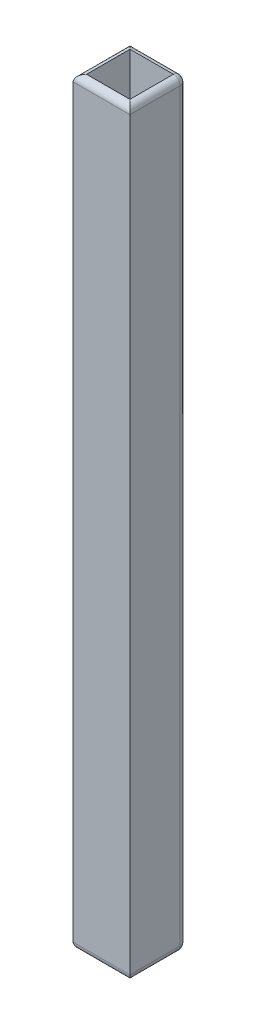
ISO-10303-21;
HEADER;
FILE_DESCRIPTION(('STEP AP214'),'2;1');
FILE_NAME('part.step','',(''),(''),'','','');
FILE_SCHEMA(('AUTOMOTIVE_DESIGN { 1 0 10303 214 1 1 1 1 }'));
ENDSEC;
DATA;
#1=APPLICATION_CONTEXT('core data for automotive mechanical design processes');
#2=APPLICATION_PROTOCOL_DEFINITION('international standard','automotive_design',2000,#1);
#3=PRODUCT_CONTEXT('',#1,'mechanical');
#4=PRODUCT('Part','Part','',(#3));
#5=PRODUCT_RELATED_PRODUCT_CATEGORY('part','',(#4));
#6=PRODUCT_DEFINITION_FORMATION('','',#4);
#7=PRODUCT_DEFINITION_CONTEXT('part definition',#1,'design');
#8=PRODUCT_DEFINITION('design','',#6,#7);
#9=PRODUCT_DEFINITION_SHAPE('','',#8);
#10=(LENGTH_UNIT() NAMED_UNIT(*) SI_UNIT(.MILLI.,.METRE.));
#11=(NAMED_UNIT(*) PLANE_ANGLE_UNIT() SI_UNIT($,.RADIAN.));
#12=(NAMED_UNIT(*) SI_UNIT($,.STERADIAN.) SOLID_ANGLE_UNIT());
#13=UNCERTAINTY_MEASURE_WITH_UNIT(LENGTH_MEASURE(1.E-05),#10,'distance_accuracy_value','');
#14=(GEOMETRIC_REPRESENTATION_CONTEXT(3) GLOBAL_UNCERTAINTY_ASSIGNED_CONTEXT((#13)) GLOBAL_UNIT_ASSIGNED_CONTEXT((#10,
#11,#12)) REPRESENTATION_CONTEXT('',''));
#15=CARTESIAN_POINT('',(0.,0.,0.));
#16=DIRECTION('',(0.,0.,1.));
#17=DIRECTION('',(1.,0.,0.));
#18=AXIS2_PLACEMENT_3D('',#15,#16,#17);
#19=CARTESIAN_POINT('',(-4.25,56.75,4.25));
#20=DIRECTION('',(1.,0.,0.));
#21=DIRECTION('',(0.,0.,-1.));
#22=AXIS2_PLACEMENT_3D('',#19,#20,#21);
#23=PLANE('',#22);
#24=DIRECTION('',(0.,-1.,0.));
#25=VECTOR('',#24,1.);
#26=CARTESIAN_POINT('',(-4.25,56.75,-4.25));
#27=LINE('',#26,#25);
#28=CARTESIAN_POINT('',(-4.25,55.75,-4.25));
#29=VERTEX_POINT('',#28);
#30=CARTESIAN_POINT('',(-4.25,-55.75,-4.25));
#31=VERTEX_POINT('',#30);
#32=EDGE_CURVE('E129',#29,#31,#27,.T.);
#33=ORIENTED_EDGE('',*,*,#32,.T.);
#34=DIRECTION('',(0.,0.,1.));
#35=VECTOR('',#34,1.);
#36=CARTESIAN_POINT('',(-4.25,-55.75,4.25));
#37=LINE('',#36,#35);
#38=CARTESIAN_POINT('',(-4.25,-55.75,4.25));
#39=VERTEX_POINT('',#38);
#40=EDGE_CURVE('E56',#31,#39,#37,.T.);
#41=ORIENTED_EDGE('',*,*,#40,.T.);
#42=DIRECTION('',(0.,-1.,0.));
#43=VECTOR('',#42,1.);
#44=CARTESIAN_POINT('',(-4.25,56.75,4.25));
#45=LINE('',#44,#43);
#46=CARTESIAN_POINT('',(-4.25,55.75,4.25));
#47=VERTEX_POINT('',#46);
#48=EDGE_CURVE('E213',#47,#39,#45,.T.);
#49=ORIENTED_EDGE('',*,*,#48,.F.);
#50=DIRECTION('',(0.,0.,1.));
#51=VECTOR('',#50,1.);
#52=CARTESIAN_POINT('',(-4.25,55.75,4.25));
#53=LINE('',#52,#51);
#54=EDGE_CURVE('E218',#47,#29,#53,.F.);
#55=ORIENTED_EDGE('',*,*,#54,.T.);
#56=EDGE_LOOP('',(#33,#41,#49,#55));
#57=FACE_BOUND('',#56,.T.);
#58=ADVANCED_FACE('F33',(#57),#23,.F.);
#59=CARTESIAN_POINT('',(-4.25,56.75,4.25));
#60=DIRECTION('',(0.,0.,-1.));
#61=DIRECTION('',(-1.,0.,0.));
#62=AXIS2_PLACEMENT_3D('',#59,#60,#61);
#63=PLANE('',#62);
#64=ORIENTED_EDGE('',*,*,#48,.T.);
#65=DIRECTION('',(1.,0.,0.));
#66=VECTOR('',#65,1.);
#67=CARTESIAN_POINT('',(4.25,-55.75,4.25));
#68=LINE('',#67,#66);
#69=CARTESIAN_POINT('',(4.25,-55.75,4.25));
#70=VERTEX_POINT('',#69);
#71=EDGE_CURVE('E11',#39,#70,#68,.T.);
#72=ORIENTED_EDGE('',*,*,#71,.T.);
#73=DIRECTION('',(0.,-1.,0.));
#74=VECTOR('',#73,1.);
#75=CARTESIAN_POINT('',(4.25,56.75,4.25));
#76=LINE('',#75,#74);
#77=CARTESIAN_POINT('',(4.25,55.75,4.25));
#78=VERTEX_POINT('',#77);
#79=EDGE_CURVE('E211',#78,#70,#76,.T.);
#80=ORIENTED_EDGE('',*,*,#79,.F.);
#81=DIRECTION('',(1.,0.,0.));
#82=VECTOR('',#81,1.);
#83=CARTESIAN_POINT('',(-4.25,55.75,4.25));
#84=LINE('',#83,#82);
#85=EDGE_CURVE('E157',#78,#47,#84,.F.);
#86=ORIENTED_EDGE('',*,*,#85,.T.);
#87=EDGE_LOOP('',(#64,#72,#80,#86));
#88=FACE_BOUND('',#87,.T.);
#89=ADVANCED_FACE('F222',(#88),#63,.F.);
#90=CARTESIAN_POINT('',(4.25,56.75,4.25));
#91=DIRECTION('',(-1.,0.,0.));
#92=DIRECTION('',(0.,0.,1.));
#93=AXIS2_PLACEMENT_3D('',#90,#91,#92);
#94=PLANE('',#93);
#95=ORIENTED_EDGE('',*,*,#79,.T.);
#96=DIRECTION('',(0.,0.,-1.));
#97=VECTOR('',#96,1.);
#98=CARTESIAN_POINT('',(4.25,-55.75,-3.24999999999999));
#99=LINE('',#98,#97);
#100=CARTESIAN_POINT('',(4.25,-55.75,-3.24999999999999));
#101=VERTEX_POINT('',#100);
#102=EDGE_CURVE('E42',#70,#101,#99,.T.);
#103=ORIENTED_EDGE('',*,*,#102,.T.);
#104=DIRECTION('',(0.,-1.,0.));
#105=VECTOR('',#104,1.);
#106=CARTESIAN_POINT('',(4.25,56.75,-3.24999999999999));
#107=LINE('',#106,#105);
#108=CARTESIAN_POINT('',(4.25,55.75,-3.24999999999999));
#109=VERTEX_POINT('',#108);
#110=EDGE_CURVE('E208',#109,#101,#107,.T.);
#111=ORIENTED_EDGE('',*,*,#110,.F.);
#112=DIRECTION('',(0.,0.,-1.));
#113=VECTOR('',#112,1.);
#114=CARTESIAN_POINT('',(4.25,55.75,4.25));
#115=LINE('',#114,#113);
#116=EDGE_CURVE('E146',#109,#78,#115,.F.);
#117=ORIENTED_EDGE('',*,*,#116,.T.);
#118=EDGE_LOOP('',(#95,#103,#111,#117));
#119=FACE_BOUND('',#118,.T.);
#120=ADVANCED_FACE('F265',(#119),#94,.F.);
#121=CARTESIAN_POINT('',(3.25,56.75,-3.25));
#122=DIRECTION('',(0.,-1.,0.));
#123=DIRECTION('',(0.,0.,-1.));
#124=AXIS2_PLACEMENT_3D('',#121,#122,#123);
#125=CYLINDRICAL_SURFACE('',#124,1.);
#126=ORIENTED_EDGE('',*,*,#110,.T.);
#127=CARTESIAN_POINT('',(3.25,-55.75,-3.25));
#128=DIRECTION('',(0.,-1.,0.));
#129=DIRECTION('',(0.,0.,-1.));
#130=AXIS2_PLACEMENT_3D('',#127,#128,#129);
#131=CIRCLE('',#130,1.);
#132=CARTESIAN_POINT('',(3.24999999999999,-55.75,-4.25));
#133=VERTEX_POINT('',#132);
#134=EDGE_CURVE('E167',#101,#133,#131,.F.);
#135=ORIENTED_EDGE('',*,*,#134,.T.);
#136=DIRECTION('',(0.,-1.,0.));
#137=VECTOR('',#136,1.);
#138=CARTESIAN_POINT('',(3.24999999999999,56.75,-4.25));
#139=LINE('',#138,#137);
#140=CARTESIAN_POINT('',(3.24999999999999,55.75,-4.25));
#141=VERTEX_POINT('',#140);
#142=EDGE_CURVE('E205',#141,#133,#139,.T.);
#143=ORIENTED_EDGE('',*,*,#142,.F.);
#144=CARTESIAN_POINT('',(3.25,55.75,-3.25));
#145=DIRECTION('',(0.,-1.,0.));
#146=DIRECTION('',(0.,0.,-1.));
#147=AXIS2_PLACEMENT_3D('',#144,#145,#146);
#148=CIRCLE('',#147,1.);
#149=EDGE_CURVE('E152',#141,#109,#148,.T.);
#150=ORIENTED_EDGE('',*,*,#149,.T.);
#151=EDGE_LOOP('',(#126,#135,#143,#150));
#152=FACE_BOUND('',#151,.T.);
#153=ADVANCED_FACE('F234',(#152),#125,.T.);
#154=CARTESIAN_POINT('',(-4.25,56.75,-4.25));
#155=DIRECTION('',(0.,0.,1.));
#156=DIRECTION('',(1.,0.,0.));
#157=AXIS2_PLACEMENT_3D('',#154,#155,#156);
#158=PLANE('',#157);
#159=ORIENTED_EDGE('',*,*,#142,.T.);
#160=DIRECTION('',(-1.,0.,0.));
#161=VECTOR('',#160,1.);
#162=CARTESIAN_POINT('',(-4.25,-55.75,-4.25));
#163=LINE('',#162,#161);
#164=EDGE_CURVE('E170',#133,#31,#163,.T.);
#165=ORIENTED_EDGE('',*,*,#164,.T.);
#166=ORIENTED_EDGE('',*,*,#32,.F.);
#167=DIRECTION('',(-1.,0.,0.));
#168=VECTOR('',#167,1.);
#169=CARTESIAN_POINT('',(-4.25,55.75,-4.25));
#170=LINE('',#169,#168);
#171=EDGE_CURVE('E216',#29,#141,#170,.F.);
#172=ORIENTED_EDGE('',*,*,#171,.T.);
#173=EDGE_LOOP('',(#159,#165,#166,#172));
#174=FACE_BOUND('',#173,.T.);
#175=ADVANCED_FACE('F232',(#174),#158,.F.);
#176=CARTESIAN_POINT('',(3.25,56.75,3.25));
#177=DIRECTION('',(-1.,0.,0.));
#178=DIRECTION('',(0.,0.,1.));
#179=AXIS2_PLACEMENT_3D('',#176,#177,#178);
#180=PLANE('',#179);
#181=DIRECTION('',(0.,0.,-1.));
#182=VECTOR('',#181,1.);
#183=CARTESIAN_POINT('',(3.25,-56.75,3.25));
#184=LINE('',#183,#182);
#185=CARTESIAN_POINT('',(3.25,-56.75,3.25));
#186=VERTEX_POINT('',#185);
#187=CARTESIAN_POINT('',(3.25,-56.75,-3.25));
#188=VERTEX_POINT('',#187);
#189=EDGE_CURVE('E166',#186,#188,#184,.T.);
#190=ORIENTED_EDGE('',*,*,#189,.F.);
#191=DIRECTION('',(0.,-1.,0.));
#192=VECTOR('',#191,1.);
#193=CARTESIAN_POINT('',(3.25,56.75,3.25));
#194=LINE('',#193,#192);
#195=CARTESIAN_POINT('',(3.25,56.75,3.25));
#196=VERTEX_POINT('',#195);
#197=EDGE_CURVE('E113',#196,#186,#194,.T.);
#198=ORIENTED_EDGE('',*,*,#197,.F.);
#199=DIRECTION('',(0.,0.,-1.));
#200=VECTOR('',#199,1.);
#201=CARTESIAN_POINT('',(3.25,56.75,3.25));
#202=LINE('',#201,#200);
#203=CARTESIAN_POINT('',(3.25,56.75,-3.25));
#204=VERTEX_POINT('',#203);
#205=EDGE_CURVE('E108',#196,#204,#202,.T.);
#206=ORIENTED_EDGE('',*,*,#205,.T.);
#207=DIRECTION('',(0.,-1.,0.));
#208=VECTOR('',#207,1.);
#209=CARTESIAN_POINT('',(3.25,56.75,-3.25));
#210=LINE('',#209,#208);
#211=EDGE_CURVE('E111',#204,#188,#210,.T.);
#212=ORIENTED_EDGE('',*,*,#211,.T.);
#213=EDGE_LOOP('',(#190,#198,#206,#212));
#214=FACE_BOUND('',#213,.T.);
#215=ADVANCED_FACE('F110',(#214),#180,.T.);
#216=CARTESIAN_POINT('',(-3.25,56.75,-3.25));
#217=DIRECTION('',(0.,0.,1.));
#218=DIRECTION('',(1.,0.,0.));
#219=AXIS2_PLACEMENT_3D('',#216,#217,#218);
#220=PLANE('',#219);
#221=DIRECTION('',(-1.,0.,0.));
#222=VECTOR('',#221,1.);
#223=CARTESIAN_POINT('',(-3.25,-56.75,-3.25));
#224=LINE('',#223,#222);
#225=CARTESIAN_POINT('',(-3.25,-56.75,-3.25));
#226=VERTEX_POINT('',#225);
#227=EDGE_CURVE('E128',#188,#226,#224,.T.);
#228=ORIENTED_EDGE('',*,*,#227,.F.);
#229=ORIENTED_EDGE('',*,*,#211,.F.);
#230=DIRECTION('',(-1.,0.,0.));
#231=VECTOR('',#230,1.);
#232=CARTESIAN_POINT('',(-3.25,56.75,-3.25));
#233=LINE('',#232,#231);
#234=CARTESIAN_POINT('',(-3.25,56.75,-3.25));
#235=VERTEX_POINT('',#234);
#236=EDGE_CURVE('E118',#204,#235,#233,.T.);
#237=ORIENTED_EDGE('',*,*,#236,.T.);
#238=DIRECTION('',(0.,-1.,0.));
#239=VECTOR('',#238,1.);
#240=CARTESIAN_POINT('',(-3.25,56.75,-3.25));
#241=LINE('',#240,#239);
#242=EDGE_CURVE('E130',#235,#226,#241,.T.);
#243=ORIENTED_EDGE('',*,*,#242,.T.);
#244=EDGE_LOOP('',(#228,#229,#237,#243));
#245=FACE_BOUND('',#244,.T.);
#246=ADVANCED_FACE('F125',(#245),#220,.T.);
#247=CARTESIAN_POINT('',(-3.25,56.75,3.25));
#248=DIRECTION('',(1.,0.,0.));
#249=DIRECTION('',(0.,0.,-1.));
#250=AXIS2_PLACEMENT_3D('',#247,#248,#249);
#251=PLANE('',#250);
#252=DIRECTION('',(0.,0.,1.));
#253=VECTOR('',#252,1.);
#254=CARTESIAN_POINT('',(-3.25,-56.75,3.25));
#255=LINE('',#254,#253);
#256=CARTESIAN_POINT('',(-3.25,-56.75,3.25));
#257=VERTEX_POINT('',#256);
#258=EDGE_CURVE('E194',#226,#257,#255,.T.);
#259=ORIENTED_EDGE('',*,*,#258,.F.);
#260=ORIENTED_EDGE('',*,*,#242,.F.);
#261=DIRECTION('',(0.,0.,1.));
#262=VECTOR('',#261,1.);
#263=CARTESIAN_POINT('',(-3.25,56.75,3.25));
#264=LINE('',#263,#262);
#265=CARTESIAN_POINT('',(-3.25,56.75,3.25));
#266=VERTEX_POINT('',#265);
#267=EDGE_CURVE('E141',#235,#266,#264,.T.);
#268=ORIENTED_EDGE('',*,*,#267,.T.);
#269=DIRECTION('',(0.,-1.,0.));
#270=VECTOR('',#269,1.);
#271=CARTESIAN_POINT('',(-3.25,56.75,3.25));
#272=LINE('',#271,#270);
#273=EDGE_CURVE('E200',#266,#257,#272,.T.);
#274=ORIENTED_EDGE('',*,*,#273,.T.);
#275=EDGE_LOOP('',(#259,#260,#268,#274));
#276=FACE_BOUND('',#275,.T.);
#277=ADVANCED_FACE('F247',(#276),#251,.T.);
#278=CARTESIAN_POINT('',(-3.25,56.75,3.25));
#279=DIRECTION('',(0.,0.,-1.));
#280=DIRECTION('',(-1.,0.,0.));
#281=AXIS2_PLACEMENT_3D('',#278,#279,#280);
#282=PLANE('',#281);
#283=DIRECTION('',(1.,0.,0.));
#284=VECTOR('',#283,1.);
#285=CARTESIAN_POINT('',(-3.25,-56.75,3.25));
#286=LINE('',#285,#284);
#287=EDGE_CURVE('E119',#257,#186,#286,.T.);
#288=ORIENTED_EDGE('',*,*,#287,.F.);
#289=ORIENTED_EDGE('',*,*,#273,.F.);
#290=DIRECTION('',(1.,0.,0.));
#291=VECTOR('',#290,1.);
#292=CARTESIAN_POINT('',(-3.25,56.75,3.25));
#293=LINE('',#292,#291);
#294=EDGE_CURVE('E201',#266,#196,#293,.T.);
#295=ORIENTED_EDGE('',*,*,#294,.T.);
#296=ORIENTED_EDGE('',*,*,#197,.T.);
#297=EDGE_LOOP('',(#288,#289,#295,#296));
#298=FACE_BOUND('',#297,.T.);
#299=ADVANCED_FACE('F248',(#298),#282,.T.);
#300=CARTESIAN_POINT('',(3.25,55.75,3.25));
#301=DIRECTION('',(1.,0.,0.));
#302=DIRECTION('',(0.,0.,-1.));
#303=AXIS2_PLACEMENT_3D('',#300,#301,#302);
#304=CYLINDRICAL_SURFACE('',#303,1.);
#305=CARTESIAN_POINT('',(3.25,55.75,3.25));
#306=DIRECTION('',(0.707106781186547,0.,-0.707106781186547));
#307=DIRECTION('',(0.707106781186547,0.,0.707106781186547));
#308=AXIS2_PLACEMENT_3D('',#305,#306,#307);
#309=ELLIPSE('',#308,1.41421356237309,1.);
#310=EDGE_CURVE('E161',#196,#78,#309,.T.);
#311=ORIENTED_EDGE('',*,*,#310,.F.);
#312=ORIENTED_EDGE('',*,*,#294,.F.);
#313=CARTESIAN_POINT('',(-3.25,55.75,3.25));
#314=DIRECTION('',(0.707106781186547,0.,0.707106781186547));
#315=DIRECTION('',(0.707106781186547,0.,-0.707106781186547));
#316=AXIS2_PLACEMENT_3D('',#313,#314,#315);
#317=ELLIPSE('',#316,1.41421356237309,1.);
#318=EDGE_CURVE('E163',#47,#266,#317,.F.);
#319=ORIENTED_EDGE('',*,*,#318,.F.);
#320=ORIENTED_EDGE('',*,*,#85,.F.);
#321=EDGE_LOOP('',(#311,#312,#319,#320));
#322=FACE_BOUND('',#321,.T.);
#323=ADVANCED_FACE('F226',(#322),#304,.T.);
#324=CARTESIAN_POINT('',(-3.25,55.75,-3.25));
#325=DIRECTION('',(0.,0.,1.));
#326=DIRECTION('',(1.,0.,0.));
#327=AXIS2_PLACEMENT_3D('',#324,#325,#326);
#328=CYLINDRICAL_SURFACE('',#327,1.);
#329=ORIENTED_EDGE('',*,*,#318,.T.);
#330=ORIENTED_EDGE('',*,*,#267,.F.);
#331=CARTESIAN_POINT('',(-3.25,55.75,-3.25));
#332=DIRECTION('',(-0.707106781186547,0.,0.707106781186547));
#333=DIRECTION('',(0.707106781186547,0.,0.707106781186547));
#334=AXIS2_PLACEMENT_3D('',#331,#332,#333);
#335=ELLIPSE('',#334,1.41421356237309,1.);
#336=EDGE_CURVE('E139',#29,#235,#335,.F.);
#337=ORIENTED_EDGE('',*,*,#336,.F.);
#338=ORIENTED_EDGE('',*,*,#54,.F.);
#339=EDGE_LOOP('',(#329,#330,#337,#338));
#340=FACE_BOUND('',#339,.T.);
#341=ADVANCED_FACE('F228',(#340),#328,.T.);
#342=CARTESIAN_POINT('',(3.25,55.75,-3.25));
#343=DIRECTION('',(0.,0.,-1.));
#344=DIRECTION('',(-1.,0.,0.));
#345=AXIS2_PLACEMENT_3D('',#342,#343,#344);
#346=CYLINDRICAL_SURFACE('',#345,1.);
#347=ORIENTED_EDGE('',*,*,#310,.T.);
#348=ORIENTED_EDGE('',*,*,#116,.F.);
#349=CARTESIAN_POINT('',(3.25,55.75,-3.25));
#350=DIRECTION('',(0.,0.,-1.));
#351=DIRECTION('',(-1.,0.,0.));
#352=AXIS2_PLACEMENT_3D('',#349,#350,#351);
#353=CIRCLE('',#352,1.);
#354=EDGE_CURVE('E144',#204,#109,#353,.T.);
#355=ORIENTED_EDGE('',*,*,#354,.F.);
#356=ORIENTED_EDGE('',*,*,#205,.F.);
#357=EDGE_LOOP('',(#347,#348,#355,#356));
#358=FACE_BOUND('',#357,.T.);
#359=ADVANCED_FACE('F145',(#358),#346,.T.);
#360=CARTESIAN_POINT('',(3.25,55.75,-3.25));
#361=DIRECTION('',(-1.,0.,0.));
#362=DIRECTION('',(0.,0.,1.));
#363=AXIS2_PLACEMENT_3D('',#360,#361,#362);
#364=CYLINDRICAL_SURFACE('',#363,1.);
#365=ORIENTED_EDGE('',*,*,#336,.T.);
#366=ORIENTED_EDGE('',*,*,#236,.F.);
#367=CARTESIAN_POINT('',(3.24999999999999,55.75,-3.25));
#368=DIRECTION('',(1.,0.,0.));
#369=DIRECTION('',(0.,1.,0.));
#370=AXIS2_PLACEMENT_3D('',#367,#368,#369);
#371=CIRCLE('',#370,1.);
#372=EDGE_CURVE('E137',#141,#204,#371,.T.);
#373=ORIENTED_EDGE('',*,*,#372,.F.);
#374=ORIENTED_EDGE('',*,*,#171,.F.);
#375=EDGE_LOOP('',(#365,#366,#373,#374));
#376=FACE_BOUND('',#375,.T.);
#377=ADVANCED_FACE('F134',(#376),#364,.T.);
#378=CARTESIAN_POINT('',(3.25,55.75,-3.25));
#379=DIRECTION('',(0.,-1.,0.));
#380=DIRECTION('',(0.,0.,-1.));
#381=AXIS2_PLACEMENT_3D('',#378,#379,#380);
#382=SPHERICAL_SURFACE('',#381,1.);
#383=ORIENTED_EDGE('',*,*,#354,.T.);
#384=ORIENTED_EDGE('',*,*,#149,.F.);
#385=ORIENTED_EDGE('',*,*,#372,.T.);
#386=EDGE_LOOP('',(#383,#384,#385));
#387=FACE_BOUND('',#386,.T.);
#388=ADVANCED_FACE('F151',(#387),#382,.T.);
#389=CARTESIAN_POINT('',(-4.25,-55.75,3.25));
#390=DIRECTION('',(-1.,0.,0.));
#391=DIRECTION('',(0.,0.,1.));
#392=AXIS2_PLACEMENT_3D('',#389,#390,#391);
#393=CYLINDRICAL_SURFACE('',#392,1.);
#394=CARTESIAN_POINT('',(3.25,-55.75,3.25));
#395=DIRECTION('',(-0.707106781186547,0.,0.707106781186547));
#396=DIRECTION('',(-0.707106781186547,0.,-0.707106781186547));
#397=AXIS2_PLACEMENT_3D('',#394,#395,#396);
#398=ELLIPSE('',#397,1.41421356237309,1.);
#399=EDGE_CURVE('E155',#70,#186,#398,.F.);
#400=ORIENTED_EDGE('',*,*,#399,.F.);
#401=ORIENTED_EDGE('',*,*,#71,.F.);
#402=CARTESIAN_POINT('',(-3.25,-55.75,3.25));
#403=DIRECTION('',(-0.707106781186547,0.,-0.707106781186547));
#404=DIRECTION('',(-0.707106781186547,0.,0.707106781186547));
#405=AXIS2_PLACEMENT_3D('',#402,#403,#404);
#406=ELLIPSE('',#405,1.41421356237309,1.);
#407=EDGE_CURVE('E37',#257,#39,#406,.T.);
#408=ORIENTED_EDGE('',*,*,#407,.F.);
#409=ORIENTED_EDGE('',*,*,#287,.T.);
#410=EDGE_LOOP('',(#400,#401,#408,#409));
#411=FACE_BOUND('',#410,.T.);
#412=ADVANCED_FACE('F35',(#411),#393,.T.);
#413=CARTESIAN_POINT('',(-3.25,-55.75,4.25));
#414=DIRECTION('',(0.,0.,-1.));
#415=DIRECTION('',(-1.,0.,0.));
#416=AXIS2_PLACEMENT_3D('',#413,#414,#415);
#417=CYLINDRICAL_SURFACE('',#416,1.);
#418=ORIENTED_EDGE('',*,*,#407,.T.);
#419=ORIENTED_EDGE('',*,*,#40,.F.);
#420=CARTESIAN_POINT('',(-3.25,-55.75,-3.25));
#421=DIRECTION('',(0.707106781186547,0.,-0.707106781186547));
#422=DIRECTION('',(-0.707106781186547,0.,-0.707106781186547));
#423=AXIS2_PLACEMENT_3D('',#420,#421,#422);
#424=ELLIPSE('',#423,1.41421356237309,1.);
#425=EDGE_CURVE('E179',#226,#31,#424,.T.);
#426=ORIENTED_EDGE('',*,*,#425,.F.);
#427=ORIENTED_EDGE('',*,*,#258,.T.);
#428=EDGE_LOOP('',(#418,#419,#426,#427));
#429=FACE_BOUND('',#428,.T.);
#430=ADVANCED_FACE('F244',(#429),#417,.T.);
#431=CARTESIAN_POINT('',(3.25,-55.75,4.25));
#432=DIRECTION('',(0.,0.,1.));
#433=DIRECTION('',(1.,0.,0.));
#434=AXIS2_PLACEMENT_3D('',#431,#432,#433);
#435=CYLINDRICAL_SURFACE('',#434,1.);
#436=ORIENTED_EDGE('',*,*,#399,.T.);
#437=ORIENTED_EDGE('',*,*,#189,.T.);
#438=CARTESIAN_POINT('',(3.25,-55.75,-3.24999999999999));
#439=DIRECTION('',(0.,0.,-1.));
#440=DIRECTION('',(0.,1.,0.));
#441=AXIS2_PLACEMENT_3D('',#438,#439,#440);
#442=CIRCLE('',#441,1.);
#443=EDGE_CURVE('E176',#101,#188,#442,.T.);
#444=ORIENTED_EDGE('',*,*,#443,.F.);
#445=ORIENTED_EDGE('',*,*,#102,.F.);
#446=EDGE_LOOP('',(#436,#437,#444,#445));
#447=FACE_BOUND('',#446,.T.);
#448=ADVANCED_FACE('F186',(#447),#435,.T.);
#449=CARTESIAN_POINT('',(-4.25,-55.75,-3.25));
#450=DIRECTION('',(1.,0.,0.));
#451=DIRECTION('',(0.,0.,-1.));
#452=AXIS2_PLACEMENT_3D('',#449,#450,#451);
#453=CYLINDRICAL_SURFACE('',#452,1.);
#454=ORIENTED_EDGE('',*,*,#425,.T.);
#455=ORIENTED_EDGE('',*,*,#164,.F.);
#456=CARTESIAN_POINT('',(3.25,-55.75,-3.25));
#457=DIRECTION('',(1.,0.,0.));
#458=DIRECTION('',(0.,0.,-1.));
#459=AXIS2_PLACEMENT_3D('',#456,#457,#458);
#460=CIRCLE('',#459,1.);
#461=EDGE_CURVE('E174',#188,#133,#460,.T.);
#462=ORIENTED_EDGE('',*,*,#461,.F.);
#463=ORIENTED_EDGE('',*,*,#227,.T.);
#464=EDGE_LOOP('',(#454,#455,#462,#463));
#465=FACE_BOUND('',#464,.T.);
#466=ADVANCED_FACE('F241',(#465),#453,.T.);
#467=CARTESIAN_POINT('',(3.25,-55.75,-3.25));
#468=DIRECTION('',(0.,-1.,0.));
#469=DIRECTION('',(0.,0.,-1.));
#470=AXIS2_PLACEMENT_3D('',#467,#468,#469);
#471=SPHERICAL_SURFACE('',#470,1.);
#472=ORIENTED_EDGE('',*,*,#134,.F.);
#473=ORIENTED_EDGE('',*,*,#443,.T.);
#474=ORIENTED_EDGE('',*,*,#461,.T.);
#475=EDGE_LOOP('',(#472,#473,#474));
#476=FACE_BOUND('',#475,.T.);
#477=ADVANCED_FACE('F238',(#476),#471,.T.);
#478=CLOSED_SHELL('',(#58,#89,#120,#153,#175,#215,#246,#277,#299,#323,#341,#359,#377,#388,#412,
#430,#448,#466,#477));
#479=MANIFOLD_SOLID_BREP('B2',#478);
#480=ADVANCED_BREP_SHAPE_REPRESENTATION('',(#18,#479),#14);
#481=SHAPE_DEFINITION_REPRESENTATION(#9,#480);
ENDSEC;
END-ISO-10303-21;
